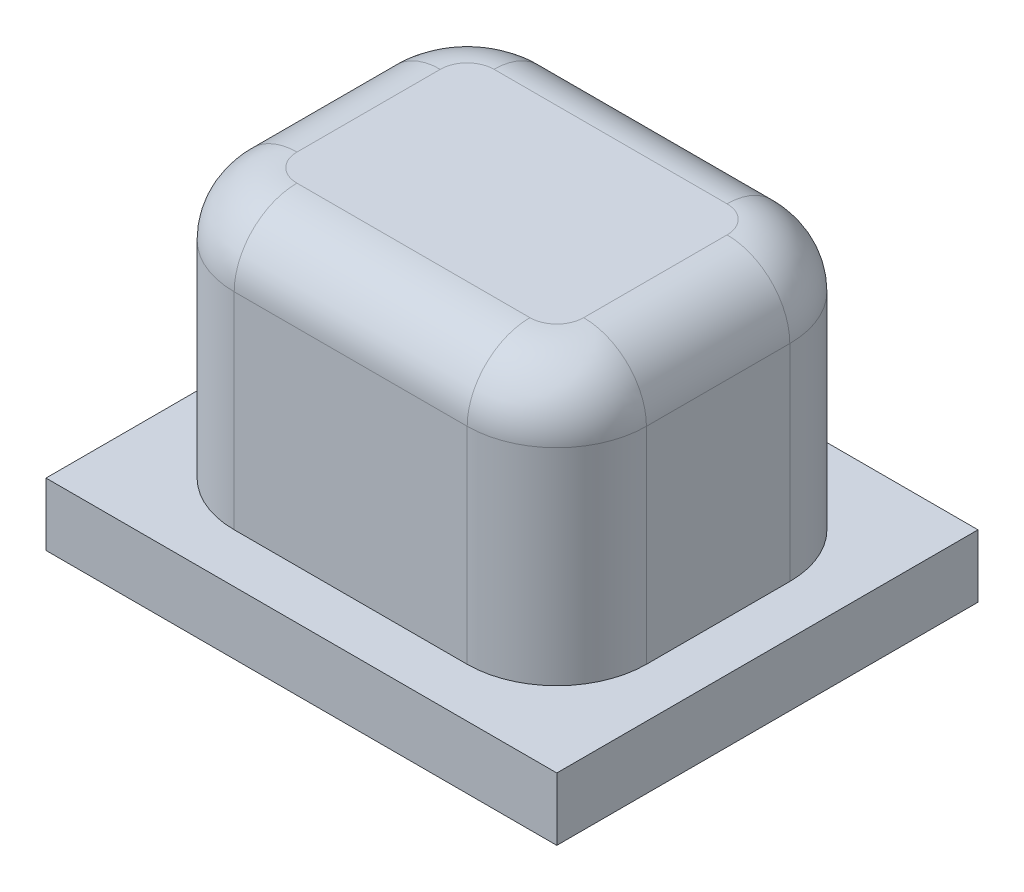
ISO-10303-21;
HEADER;
FILE_DESCRIPTION(('STEP AP214'),'2;1');
FILE_NAME('part.step','',(''),(''),'','','');
FILE_SCHEMA(('AUTOMOTIVE_DESIGN { 1 0 10303 214 1 1 1 1 }'));
ENDSEC;
DATA;
#1=APPLICATION_CONTEXT('core data for automotive mechanical design processes');
#2=APPLICATION_PROTOCOL_DEFINITION('international standard','automotive_design',2000,#1);
#3=PRODUCT_CONTEXT('',#1,'mechanical');
#4=PRODUCT('Part','Part','',(#3));
#5=PRODUCT_RELATED_PRODUCT_CATEGORY('part','',(#4));
#6=PRODUCT_DEFINITION_FORMATION('','',#4);
#7=PRODUCT_DEFINITION_CONTEXT('part definition',#1,'design');
#8=PRODUCT_DEFINITION('design','',#6,#7);
#9=PRODUCT_DEFINITION_SHAPE('','',#8);
#10=(LENGTH_UNIT() NAMED_UNIT(*) SI_UNIT(.MILLI.,.METRE.));
#11=(NAMED_UNIT(*) PLANE_ANGLE_UNIT() SI_UNIT($,.RADIAN.));
#12=(NAMED_UNIT(*) SI_UNIT($,.STERADIAN.) SOLID_ANGLE_UNIT());
#13=UNCERTAINTY_MEASURE_WITH_UNIT(LENGTH_MEASURE(1.E-05),#10,'distance_accuracy_value','');
#14=(GEOMETRIC_REPRESENTATION_CONTEXT(3) GLOBAL_UNCERTAINTY_ASSIGNED_CONTEXT((#13)) GLOBAL_UNIT_ASSIGNED_CONTEXT((#10,
#11,#12)) REPRESENTATION_CONTEXT('',''));
#15=CARTESIAN_POINT('',(0.,0.,0.));
#16=DIRECTION('',(0.,0.,1.));
#17=DIRECTION('',(1.,0.,0.));
#18=AXIS2_PLACEMENT_3D('',#15,#16,#17);
#19=CARTESIAN_POINT('',(1.3,3.,0.8));
#20=DIRECTION('',(0.,-1.,0.));
#21=DIRECTION('',(0.,0.,-1.));
#22=AXIS2_PLACEMENT_3D('',#19,#20,#21);
#23=CYLINDRICAL_SURFACE('',#22,1.);
#24=DIRECTION('',(0.,-1.,0.));
#25=VECTOR('',#24,1.);
#26=CARTESIAN_POINT('',(2.3,3.,0.8));
#27=LINE('',#26,#25);
#28=CARTESIAN_POINT('',(2.3,2.3,0.8));
#29=VERTEX_POINT('',#28);
#30=CARTESIAN_POINT('',(2.3,0.,0.8));
#31=VERTEX_POINT('',#30);
#32=EDGE_CURVE('E337',#29,#31,#27,.T.);
#33=ORIENTED_EDGE('',*,*,#32,.F.);
#34=CARTESIAN_POINT('',(1.3,2.3,0.8));
#35=DIRECTION('',(0.,1.,0.));
#36=DIRECTION('',(0.,0.,1.));
#37=AXIS2_PLACEMENT_3D('',#34,#35,#36);
#38=CIRCLE('',#37,1.);
#39=CARTESIAN_POINT('',(1.3,2.3,1.8));
#40=VERTEX_POINT('',#39);
#41=EDGE_CURVE('E361',#29,#40,#38,.F.);
#42=ORIENTED_EDGE('',*,*,#41,.T.);
#43=DIRECTION('',(0.,-1.,0.));
#44=VECTOR('',#43,1.);
#45=CARTESIAN_POINT('',(1.3,3.,1.8));
#46=LINE('',#45,#44);
#47=CARTESIAN_POINT('',(1.3,0.,1.8));
#48=VERTEX_POINT('',#47);
#49=EDGE_CURVE('E323',#40,#48,#46,.T.);
#50=ORIENTED_EDGE('',*,*,#49,.T.);
#51=CARTESIAN_POINT('',(1.3,0.,0.8));
#52=DIRECTION('',(0.,1.,0.));
#53=DIRECTION('',(0.,0.,1.));
#54=AXIS2_PLACEMENT_3D('',#51,#52,#53);
#55=CIRCLE('',#54,1.);
#56=EDGE_CURVE('E299',#48,#31,#55,.T.);
#57=ORIENTED_EDGE('',*,*,#56,.T.);
#58=EDGE_LOOP('',(#33,#42,#50,#57));
#59=FACE_BOUND('',#58,.T.);
#60=ADVANCED_FACE('F33',(#59),#23,.T.);
#61=CARTESIAN_POINT('',(2.3,3.,0.8));
#62=DIRECTION('',(-1.,0.,0.));
#63=DIRECTION('',(0.,0.,1.));
#64=AXIS2_PLACEMENT_3D('',#61,#62,#63);
#65=PLANE('',#64);
#66=DIRECTION('',(0.,-1.,0.));
#67=VECTOR('',#66,1.);
#68=CARTESIAN_POINT('',(2.3,3.,-0.8));
#69=LINE('',#68,#67);
#70=CARTESIAN_POINT('',(2.3,2.3,-0.8));
#71=VERTEX_POINT('',#70);
#72=CARTESIAN_POINT('',(2.3,0.,-0.8));
#73=VERTEX_POINT('',#72);
#74=EDGE_CURVE('E335',#71,#73,#69,.T.);
#75=ORIENTED_EDGE('',*,*,#74,.F.);
#76=DIRECTION('',(0.,0.,-1.));
#77=VECTOR('',#76,1.);
#78=CARTESIAN_POINT('',(2.3,2.3,0.8));
#79=LINE('',#78,#77);
#80=EDGE_CURVE('E359',#71,#29,#79,.F.);
#81=ORIENTED_EDGE('',*,*,#80,.T.);
#82=ORIENTED_EDGE('',*,*,#32,.T.);
#83=DIRECTION('',(0.,0.,-1.));
#84=VECTOR('',#83,1.);
#85=CARTESIAN_POINT('',(2.3,0.,0.8));
#86=LINE('',#85,#84);
#87=EDGE_CURVE('E302',#31,#73,#86,.T.);
#88=ORIENTED_EDGE('',*,*,#87,.T.);
#89=EDGE_LOOP('',(#75,#81,#82,#88));
#90=FACE_BOUND('',#89,.T.);
#91=ADVANCED_FACE('F436',(#90),#65,.F.);
#92=CARTESIAN_POINT('',(1.3,3.,-0.8));
#93=DIRECTION('',(0.,-1.,0.));
#94=DIRECTION('',(0.,0.,-1.));
#95=AXIS2_PLACEMENT_3D('',#92,#93,#94);
#96=CYLINDRICAL_SURFACE('',#95,1.);
#97=DIRECTION('',(0.,-1.,0.));
#98=VECTOR('',#97,1.);
#99=CARTESIAN_POINT('',(1.3,3.,-1.8));
#100=LINE('',#99,#98);
#101=CARTESIAN_POINT('',(1.3,2.3,-1.8));
#102=VERTEX_POINT('',#101);
#103=CARTESIAN_POINT('',(1.3,0.,-1.8));
#104=VERTEX_POINT('',#103);
#105=EDGE_CURVE('E333',#102,#104,#100,.T.);
#106=ORIENTED_EDGE('',*,*,#105,.F.);
#107=CARTESIAN_POINT('',(1.3,2.3,-0.8));
#108=DIRECTION('',(0.,1.,0.));
#109=DIRECTION('',(0.,0.,1.));
#110=AXIS2_PLACEMENT_3D('',#107,#108,#109);
#111=CIRCLE('',#110,1.);
#112=EDGE_CURVE('E356',#102,#71,#111,.F.);
#113=ORIENTED_EDGE('',*,*,#112,.T.);
#114=ORIENTED_EDGE('',*,*,#74,.T.);
#115=CARTESIAN_POINT('',(1.3,0.,-0.8));
#116=DIRECTION('',(0.,1.,0.));
#117=DIRECTION('',(0.,0.,-1.));
#118=AXIS2_PLACEMENT_3D('',#115,#116,#117);
#119=CIRCLE('',#118,1.);
#120=EDGE_CURVE('E305',#73,#104,#119,.T.);
#121=ORIENTED_EDGE('',*,*,#120,.T.);
#122=EDGE_LOOP('',(#106,#113,#114,#121));
#123=FACE_BOUND('',#122,.T.);
#124=ADVANCED_FACE('F433',(#123),#96,.T.);
#125=CARTESIAN_POINT('',(-1.3,3.,-1.8));
#126=DIRECTION('',(0.,0.,1.));
#127=DIRECTION('',(1.,0.,0.));
#128=AXIS2_PLACEMENT_3D('',#125,#126,#127);
#129=PLANE('',#128);
#130=DIRECTION('',(0.,-1.,0.));
#131=VECTOR('',#130,1.);
#132=CARTESIAN_POINT('',(-1.3,3.,-1.8));
#133=LINE('',#132,#131);
#134=CARTESIAN_POINT('',(-1.3,2.3,-1.8));
#135=VERTEX_POINT('',#134);
#136=CARTESIAN_POINT('',(-1.3,0.,-1.8));
#137=VERTEX_POINT('',#136);
#138=EDGE_CURVE('E331',#135,#137,#133,.T.);
#139=ORIENTED_EDGE('',*,*,#138,.F.);
#140=DIRECTION('',(-1.,0.,0.));
#141=VECTOR('',#140,1.);
#142=CARTESIAN_POINT('',(1.3,2.3,-1.8));
#143=LINE('',#142,#141);
#144=EDGE_CURVE('E11',#135,#102,#143,.F.);
#145=ORIENTED_EDGE('',*,*,#144,.T.);
#146=ORIENTED_EDGE('',*,*,#105,.T.);
#147=DIRECTION('',(-1.,0.,0.));
#148=VECTOR('',#147,1.);
#149=CARTESIAN_POINT('',(-1.3,0.,-1.8));
#150=LINE('',#149,#148);
#151=EDGE_CURVE('E308',#104,#137,#150,.T.);
#152=ORIENTED_EDGE('',*,*,#151,.T.);
#153=EDGE_LOOP('',(#139,#145,#146,#152));
#154=FACE_BOUND('',#153,.T.);
#155=ADVANCED_FACE('F415',(#154),#129,.F.);
#156=CARTESIAN_POINT('',(-1.3,3.,-0.8));
#157=DIRECTION('',(0.,-1.,0.));
#158=DIRECTION('',(0.,0.,-1.));
#159=AXIS2_PLACEMENT_3D('',#156,#157,#158);
#160=CYLINDRICAL_SURFACE('',#159,1.);
#161=DIRECTION('',(0.,-1.,0.));
#162=VECTOR('',#161,1.);
#163=CARTESIAN_POINT('',(-2.3,3.,-0.8));
#164=LINE('',#163,#162);
#165=CARTESIAN_POINT('',(-2.3,2.3,-0.8));
#166=VERTEX_POINT('',#165);
#167=CARTESIAN_POINT('',(-2.3,0.,-0.8));
#168=VERTEX_POINT('',#167);
#169=EDGE_CURVE('E329',#166,#168,#164,.T.);
#170=ORIENTED_EDGE('',*,*,#169,.F.);
#171=CARTESIAN_POINT('',(-1.3,2.3,-0.8));
#172=DIRECTION('',(0.,1.,0.));
#173=DIRECTION('',(0.,0.,1.));
#174=AXIS2_PLACEMENT_3D('',#171,#172,#173);
#175=CIRCLE('',#174,1.);
#176=EDGE_CURVE('E42',#166,#135,#175,.F.);
#177=ORIENTED_EDGE('',*,*,#176,.T.);
#178=ORIENTED_EDGE('',*,*,#138,.T.);
#179=CARTESIAN_POINT('',(-1.3,0.,-0.8));
#180=DIRECTION('',(0.,1.,0.));
#181=DIRECTION('',(0.,0.,-1.));
#182=AXIS2_PLACEMENT_3D('',#179,#180,#181);
#183=CIRCLE('',#182,1.);
#184=EDGE_CURVE('E311',#137,#168,#183,.T.);
#185=ORIENTED_EDGE('',*,*,#184,.T.);
#186=EDGE_LOOP('',(#170,#177,#178,#185));
#187=FACE_BOUND('',#186,.T.);
#188=ADVANCED_FACE('F411',(#187),#160,.T.);
#189=CARTESIAN_POINT('',(-2.3,3.,0.8));
#190=DIRECTION('',(1.,0.,0.));
#191=DIRECTION('',(0.,0.,-1.));
#192=AXIS2_PLACEMENT_3D('',#189,#190,#191);
#193=PLANE('',#192);
#194=DIRECTION('',(0.,-1.,0.));
#195=VECTOR('',#194,1.);
#196=CARTESIAN_POINT('',(-2.3,3.,0.8));
#197=LINE('',#196,#195);
#198=CARTESIAN_POINT('',(-2.3,2.3,0.8));
#199=VERTEX_POINT('',#198);
#200=CARTESIAN_POINT('',(-2.3,0.,0.8));
#201=VERTEX_POINT('',#200);
#202=EDGE_CURVE('E327',#199,#201,#197,.T.);
#203=ORIENTED_EDGE('',*,*,#202,.F.);
#204=DIRECTION('',(0.,0.,1.));
#205=VECTOR('',#204,1.);
#206=CARTESIAN_POINT('',(-2.3,2.3,-0.8));
#207=LINE('',#206,#205);
#208=EDGE_CURVE('E57',#199,#166,#207,.F.);
#209=ORIENTED_EDGE('',*,*,#208,.T.);
#210=ORIENTED_EDGE('',*,*,#169,.T.);
#211=DIRECTION('',(0.,0.,1.));
#212=VECTOR('',#211,1.);
#213=CARTESIAN_POINT('',(-2.3,0.,0.8));
#214=LINE('',#213,#212);
#215=EDGE_CURVE('E314',#168,#201,#214,.T.);
#216=ORIENTED_EDGE('',*,*,#215,.T.);
#217=EDGE_LOOP('',(#203,#209,#210,#216));
#218=FACE_BOUND('',#217,.T.);
#219=ADVANCED_FACE('F403',(#218),#193,.F.);
#220=CARTESIAN_POINT('',(-1.3,3.,0.8));
#221=DIRECTION('',(0.,-1.,0.));
#222=DIRECTION('',(0.,0.,-1.));
#223=AXIS2_PLACEMENT_3D('',#220,#221,#222);
#224=CYLINDRICAL_SURFACE('',#223,1.);
#225=DIRECTION('',(0.,-1.,0.));
#226=VECTOR('',#225,1.);
#227=CARTESIAN_POINT('',(-1.3,3.,1.8));
#228=LINE('',#227,#226);
#229=CARTESIAN_POINT('',(-1.3,2.3,1.8));
#230=VERTEX_POINT('',#229);
#231=CARTESIAN_POINT('',(-1.3,0.,1.8));
#232=VERTEX_POINT('',#231);
#233=EDGE_CURVE('E325',#230,#232,#228,.T.);
#234=ORIENTED_EDGE('',*,*,#233,.F.);
#235=CARTESIAN_POINT('',(-1.3,2.3,0.8));
#236=DIRECTION('',(0.,1.,0.));
#237=DIRECTION('',(0.,0.,1.));
#238=AXIS2_PLACEMENT_3D('',#235,#236,#237);
#239=CIRCLE('',#238,1.);
#240=EDGE_CURVE('E365',#230,#199,#239,.F.);
#241=ORIENTED_EDGE('',*,*,#240,.T.);
#242=ORIENTED_EDGE('',*,*,#202,.T.);
#243=CARTESIAN_POINT('',(-1.3,0.,0.8));
#244=DIRECTION('',(0.,1.,0.));
#245=DIRECTION('',(0.,0.,-1.));
#246=AXIS2_PLACEMENT_3D('',#243,#244,#245);
#247=CIRCLE('',#246,1.);
#248=EDGE_CURVE('E317',#201,#232,#247,.T.);
#249=ORIENTED_EDGE('',*,*,#248,.T.);
#250=EDGE_LOOP('',(#234,#241,#242,#249));
#251=FACE_BOUND('',#250,.T.);
#252=ADVANCED_FACE('F401',(#251),#224,.T.);
#253=CARTESIAN_POINT('',(-1.3,3.,1.8));
#254=DIRECTION('',(0.,0.,-1.));
#255=DIRECTION('',(-1.,0.,0.));
#256=AXIS2_PLACEMENT_3D('',#253,#254,#255);
#257=PLANE('',#256);
#258=ORIENTED_EDGE('',*,*,#49,.F.);
#259=DIRECTION('',(1.,0.,0.));
#260=VECTOR('',#259,1.);
#261=CARTESIAN_POINT('',(-1.3,2.3,1.8));
#262=LINE('',#261,#260);
#263=EDGE_CURVE('E363',#40,#230,#262,.F.);
#264=ORIENTED_EDGE('',*,*,#263,.T.);
#265=ORIENTED_EDGE('',*,*,#233,.T.);
#266=DIRECTION('',(1.,0.,0.));
#267=VECTOR('',#266,1.);
#268=CARTESIAN_POINT('',(-1.3,0.,1.8));
#269=LINE('',#268,#267);
#270=EDGE_CURVE('E320',#232,#48,#269,.T.);
#271=ORIENTED_EDGE('',*,*,#270,.T.);
#272=EDGE_LOOP('',(#258,#264,#265,#271));
#273=FACE_BOUND('',#272,.T.);
#274=ADVANCED_FACE('F443',(#273),#257,.F.);
#275=CARTESIAN_POINT('',(1.3,3.,0.8));
#276=DIRECTION('',(0.,1.,0.));
#277=DIRECTION('',(0.,0.,1.));
#278=AXIS2_PLACEMENT_3D('',#275,#276,#277);
#279=PLANE('',#278);
#280=DIRECTION('',(0.,0.,-1.));
#281=VECTOR('',#280,1.);
#282=CARTESIAN_POINT('',(1.6,3.,-0.8));
#283=LINE('',#282,#281);
#284=CARTESIAN_POINT('',(1.6,3.,0.8));
#285=VERTEX_POINT('',#284);
#286=CARTESIAN_POINT('',(1.6,3.,-0.8));
#287=VERTEX_POINT('',#286);
#288=EDGE_CURVE('E351',#285,#287,#283,.T.);
#289=ORIENTED_EDGE('',*,*,#288,.T.);
#290=CARTESIAN_POINT('',(1.3,3.,-0.8));
#291=DIRECTION('',(0.,1.,0.));
#292=DIRECTION('',(0.,0.,1.));
#293=AXIS2_PLACEMENT_3D('',#290,#291,#292);
#294=CIRCLE('',#293,0.3);
#295=CARTESIAN_POINT('',(1.3,3.,-1.1));
#296=VERTEX_POINT('',#295);
#297=EDGE_CURVE('E353',#287,#296,#294,.T.);
#298=ORIENTED_EDGE('',*,*,#297,.T.);
#299=DIRECTION('',(-1.,0.,0.));
#300=VECTOR('',#299,1.);
#301=CARTESIAN_POINT('',(-1.3,3.,-1.1));
#302=LINE('',#301,#300);
#303=CARTESIAN_POINT('',(-1.3,3.,-1.1));
#304=VERTEX_POINT('',#303);
#305=EDGE_CURVE('E339',#296,#304,#302,.T.);
#306=ORIENTED_EDGE('',*,*,#305,.T.);
#307=CARTESIAN_POINT('',(-1.3,3.,-0.8));
#308=DIRECTION('',(0.,1.,0.));
#309=DIRECTION('',(0.,0.,1.));
#310=AXIS2_PLACEMENT_3D('',#307,#308,#309);
#311=CIRCLE('',#310,0.3);
#312=CARTESIAN_POINT('',(-1.6,3.,-0.8));
#313=VERTEX_POINT('',#312);
#314=EDGE_CURVE('E341',#304,#313,#311,.T.);
#315=ORIENTED_EDGE('',*,*,#314,.T.);
#316=DIRECTION('',(0.,0.,1.));
#317=VECTOR('',#316,1.);
#318=CARTESIAN_POINT('',(-1.6,3.,0.8));
#319=LINE('',#318,#317);
#320=CARTESIAN_POINT('',(-1.6,3.,0.8));
#321=VERTEX_POINT('',#320);
#322=EDGE_CURVE('E343',#313,#321,#319,.T.);
#323=ORIENTED_EDGE('',*,*,#322,.T.);
#324=CARTESIAN_POINT('',(-1.3,3.,0.8));
#325=DIRECTION('',(0.,1.,0.));
#326=DIRECTION('',(0.,0.,1.));
#327=AXIS2_PLACEMENT_3D('',#324,#325,#326);
#328=CIRCLE('',#327,0.3);
#329=CARTESIAN_POINT('',(-1.3,3.,1.1));
#330=VERTEX_POINT('',#329);
#331=EDGE_CURVE('E345',#321,#330,#328,.T.);
#332=ORIENTED_EDGE('',*,*,#331,.T.);
#333=DIRECTION('',(1.,0.,0.));
#334=VECTOR('',#333,1.);
#335=CARTESIAN_POINT('',(1.3,3.,1.1));
#336=LINE('',#335,#334);
#337=CARTESIAN_POINT('',(1.3,3.,1.1));
#338=VERTEX_POINT('',#337);
#339=EDGE_CURVE('E347',#330,#338,#336,.T.);
#340=ORIENTED_EDGE('',*,*,#339,.T.);
#341=CARTESIAN_POINT('',(1.3,3.,0.8));
#342=DIRECTION('',(0.,1.,0.));
#343=DIRECTION('',(0.,0.,1.));
#344=AXIS2_PLACEMENT_3D('',#341,#342,#343);
#345=CIRCLE('',#344,0.3);
#346=EDGE_CURVE('E349',#338,#285,#345,.T.);
#347=ORIENTED_EDGE('',*,*,#346,.T.);
#348=EDGE_LOOP('',(#289,#298,#306,#315,#323,#332,#340,#347));
#349=FACE_BOUND('',#348,.T.);
#350=ADVANCED_FACE('F445',(#349),#279,.T.);
#351=CARTESIAN_POINT('',(0.,0.,0.));
#352=DIRECTION('',(0.,1.,0.));
#353=DIRECTION('',(0.,0.,1.));
#354=AXIS2_PLACEMENT_3D('',#351,#352,#353);
#355=PLANE('',#354);
#356=DIRECTION('',(0.,0.,1.));
#357=VECTOR('',#356,1.);
#358=CARTESIAN_POINT('',(2.85,0.,-2.35));
#359=LINE('',#358,#357);
#360=CARTESIAN_POINT('',(2.85,0.,-2.35));
#361=VERTEX_POINT('',#360);
#362=CARTESIAN_POINT('',(2.85,0.,2.35));
#363=VERTEX_POINT('',#362);
#364=EDGE_CURVE('E258',#361,#363,#359,.T.);
#365=ORIENTED_EDGE('',*,*,#364,.F.);
#366=DIRECTION('',(1.,0.,0.));
#367=VECTOR('',#366,1.);
#368=CARTESIAN_POINT('',(-2.85,0.,-2.35));
#369=LINE('',#368,#367);
#370=CARTESIAN_POINT('',(-2.85,0.,-2.35));
#371=VERTEX_POINT('',#370);
#372=EDGE_CURVE('E274',#371,#361,#369,.T.);
#373=ORIENTED_EDGE('',*,*,#372,.F.);
#374=DIRECTION('',(0.,0.,-1.));
#375=VECTOR('',#374,1.);
#376=CARTESIAN_POINT('',(-2.85,0.,-2.35));
#377=LINE('',#376,#375);
#378=CARTESIAN_POINT('',(-2.85,0.,2.35));
#379=VERTEX_POINT('',#378);
#380=EDGE_CURVE('E285',#379,#371,#377,.T.);
#381=ORIENTED_EDGE('',*,*,#380,.F.);
#382=DIRECTION('',(-1.,0.,0.));
#383=VECTOR('',#382,1.);
#384=CARTESIAN_POINT('',(-2.85,0.,2.35));
#385=LINE('',#384,#383);
#386=EDGE_CURVE('E283',#363,#379,#385,.T.);
#387=ORIENTED_EDGE('',*,*,#386,.F.);
#388=EDGE_LOOP('',(#365,#373,#381,#387));
#389=FACE_BOUND('',#388,.T.);
#390=ORIENTED_EDGE('',*,*,#56,.F.);
#391=ORIENTED_EDGE('',*,*,#270,.F.);
#392=ORIENTED_EDGE('',*,*,#248,.F.);
#393=ORIENTED_EDGE('',*,*,#215,.F.);
#394=ORIENTED_EDGE('',*,*,#184,.F.);
#395=ORIENTED_EDGE('',*,*,#151,.F.);
#396=ORIENTED_EDGE('',*,*,#120,.F.);
#397=ORIENTED_EDGE('',*,*,#87,.F.);
#398=EDGE_LOOP('',(#390,#391,#392,#393,#394,#395,#396,#397));
#399=FACE_BOUND('',#398,.T.);
#400=ADVANCED_FACE('F408',(#389,#399),#355,.T.);
#401=CARTESIAN_POINT('',(2.85,-0.7,-2.35));
#402=DIRECTION('',(-1.,0.,0.));
#403=DIRECTION('',(0.,0.,1.));
#404=AXIS2_PLACEMENT_3D('',#401,#402,#403);
#405=PLANE('',#404);
#406=ORIENTED_EDGE('',*,*,#364,.T.);
#407=DIRECTION('',(0.,1.,0.));
#408=VECTOR('',#407,1.);
#409=CARTESIAN_POINT('',(2.85,-0.7,2.35));
#410=LINE('',#409,#408);
#411=CARTESIAN_POINT('',(2.85,-0.7,2.35));
#412=VERTEX_POINT('',#411);
#413=EDGE_CURVE('E296',#412,#363,#410,.T.);
#414=ORIENTED_EDGE('',*,*,#413,.F.);
#415=DIRECTION('',(0.,0.,1.));
#416=VECTOR('',#415,1.);
#417=CARTESIAN_POINT('',(2.85,-0.7,-2.35));
#418=LINE('',#417,#416);
#419=CARTESIAN_POINT('',(2.85,-0.7,-2.35));
#420=VERTEX_POINT('',#419);
#421=EDGE_CURVE('E270',#420,#412,#418,.T.);
#422=ORIENTED_EDGE('',*,*,#421,.F.);
#423=DIRECTION('',(0.,1.,0.));
#424=VECTOR('',#423,1.);
#425=CARTESIAN_POINT('',(2.85,-0.7,-2.35));
#426=LINE('',#425,#424);
#427=EDGE_CURVE('E280',#420,#361,#426,.T.);
#428=ORIENTED_EDGE('',*,*,#427,.T.);
#429=EDGE_LOOP('',(#406,#414,#422,#428));
#430=FACE_BOUND('',#429,.T.);
#431=ADVANCED_FACE('F524',(#430),#405,.F.);
#432=CARTESIAN_POINT('',(-2.85,-0.7,2.35));
#433=DIRECTION('',(0.,0.,-1.));
#434=DIRECTION('',(-1.,0.,0.));
#435=AXIS2_PLACEMENT_3D('',#432,#433,#434);
#436=PLANE('',#435);
#437=ORIENTED_EDGE('',*,*,#386,.T.);
#438=DIRECTION('',(0.,1.,0.));
#439=VECTOR('',#438,1.);
#440=CARTESIAN_POINT('',(-2.85,-0.7,2.35));
#441=LINE('',#440,#439);
#442=CARTESIAN_POINT('',(-2.85,-0.7,2.35));
#443=VERTEX_POINT('',#442);
#444=EDGE_CURVE('E293',#443,#379,#441,.T.);
#445=ORIENTED_EDGE('',*,*,#444,.F.);
#446=DIRECTION('',(-1.,0.,0.));
#447=VECTOR('',#446,1.);
#448=CARTESIAN_POINT('',(-2.85,-0.7,2.35));
#449=LINE('',#448,#447);
#450=EDGE_CURVE('E273',#412,#443,#449,.T.);
#451=ORIENTED_EDGE('',*,*,#450,.F.);
#452=ORIENTED_EDGE('',*,*,#413,.T.);
#453=EDGE_LOOP('',(#437,#445,#451,#452));
#454=FACE_BOUND('',#453,.T.);
#455=ADVANCED_FACE('F532',(#454),#436,.F.);
#456=CARTESIAN_POINT('',(-2.85,-0.7,-2.35));
#457=DIRECTION('',(1.,0.,0.));
#458=DIRECTION('',(0.,0.,-1.));
#459=AXIS2_PLACEMENT_3D('',#456,#457,#458);
#460=PLANE('',#459);
#461=ORIENTED_EDGE('',*,*,#380,.T.);
#462=DIRECTION('',(0.,1.,0.));
#463=VECTOR('',#462,1.);
#464=CARTESIAN_POINT('',(-2.85,-0.7,-2.35));
#465=LINE('',#464,#463);
#466=CARTESIAN_POINT('',(-2.85,-0.7,-2.35));
#467=VERTEX_POINT('',#466);
#468=EDGE_CURVE('E290',#467,#371,#465,.T.);
#469=ORIENTED_EDGE('',*,*,#468,.F.);
#470=DIRECTION('',(0.,0.,-1.));
#471=VECTOR('',#470,1.);
#472=CARTESIAN_POINT('',(-2.85,-0.7,-2.35));
#473=LINE('',#472,#471);
#474=EDGE_CURVE('E276',#443,#467,#473,.T.);
#475=ORIENTED_EDGE('',*,*,#474,.F.);
#476=ORIENTED_EDGE('',*,*,#444,.T.);
#477=EDGE_LOOP('',(#461,#469,#475,#476));
#478=FACE_BOUND('',#477,.T.);
#479=ADVANCED_FACE('F528',(#478),#460,.F.);
#480=CARTESIAN_POINT('',(-2.85,-0.7,-2.35));
#481=DIRECTION('',(0.,0.,1.));
#482=DIRECTION('',(1.,0.,0.));
#483=AXIS2_PLACEMENT_3D('',#480,#481,#482);
#484=PLANE('',#483);
#485=ORIENTED_EDGE('',*,*,#372,.T.);
#486=ORIENTED_EDGE('',*,*,#427,.F.);
#487=DIRECTION('',(1.,0.,0.));
#488=VECTOR('',#487,1.);
#489=CARTESIAN_POINT('',(-2.85,-0.7,-2.35));
#490=LINE('',#489,#488);
#491=EDGE_CURVE('E278',#467,#420,#490,.T.);
#492=ORIENTED_EDGE('',*,*,#491,.F.);
#493=ORIENTED_EDGE('',*,*,#468,.T.);
#494=EDGE_LOOP('',(#485,#486,#492,#493));
#495=FACE_BOUND('',#494,.T.);
#496=ADVANCED_FACE('F520',(#495),#484,.F.);
#497=CARTESIAN_POINT('',(0.,-0.7,0.));
#498=DIRECTION('',(0.,1.,0.));
#499=DIRECTION('',(0.,0.,1.));
#500=AXIS2_PLACEMENT_3D('',#497,#498,#499);
#501=PLANE('',#500);
#502=DIRECTION('',(-1.,0.,0.));
#503=VECTOR('',#502,1.);
#504=CARTESIAN_POINT('',(-0.75,-0.7,1.25));
#505=LINE('',#504,#503);
#506=CARTESIAN_POINT('',(0.75,-0.7,1.25));
#507=VERTEX_POINT('',#506);
#508=CARTESIAN_POINT('',(-0.75,-0.7,1.25));
#509=VERTEX_POINT('',#508);
#510=EDGE_CURVE('E240',#507,#509,#505,.T.);
#511=ORIENTED_EDGE('',*,*,#510,.F.);
#512=CARTESIAN_POINT('',(0.75,-0.7,0.25));
#513=DIRECTION('',(0.,-1.,0.));
#514=DIRECTION('',(0.,0.,1.));
#515=AXIS2_PLACEMENT_3D('',#512,#513,#514);
#516=CIRCLE('',#515,1.);
#517=CARTESIAN_POINT('',(1.75,-0.7,0.25));
#518=VERTEX_POINT('',#517);
#519=EDGE_CURVE('E202',#518,#507,#516,.T.);
#520=ORIENTED_EDGE('',*,*,#519,.F.);
#521=DIRECTION('',(0.,0.,1.));
#522=VECTOR('',#521,1.);
#523=CARTESIAN_POINT('',(1.75,-0.7,-0.25));
#524=LINE('',#523,#522);
#525=CARTESIAN_POINT('',(1.75,-0.7,-0.25));
#526=VERTEX_POINT('',#525);
#527=EDGE_CURVE('E220',#526,#518,#524,.T.);
#528=ORIENTED_EDGE('',*,*,#527,.F.);
#529=CARTESIAN_POINT('',(0.75,-0.7,-0.25));
#530=DIRECTION('',(0.,-1.,0.));
#531=DIRECTION('',(0.,0.,-1.));
#532=AXIS2_PLACEMENT_3D('',#529,#530,#531);
#533=CIRCLE('',#532,1.);
#534=CARTESIAN_POINT('',(0.75,-0.7,-1.25));
#535=VERTEX_POINT('',#534);
#536=EDGE_CURVE('E223',#535,#526,#533,.T.);
#537=ORIENTED_EDGE('',*,*,#536,.F.);
#538=DIRECTION('',(1.,0.,0.));
#539=VECTOR('',#538,1.);
#540=CARTESIAN_POINT('',(-0.75,-0.7,-1.25));
#541=LINE('',#540,#539);
#542=CARTESIAN_POINT('',(-0.75,-0.7,-1.25));
#543=VERTEX_POINT('',#542);
#544=EDGE_CURVE('E251',#543,#535,#541,.T.);
#545=ORIENTED_EDGE('',*,*,#544,.F.);
#546=CARTESIAN_POINT('',(-0.75,-0.7,-0.25));
#547=DIRECTION('',(0.,-1.,0.));
#548=DIRECTION('',(0.,0.,1.));
#549=AXIS2_PLACEMENT_3D('',#546,#547,#548);
#550=CIRCLE('',#549,1.);
#551=CARTESIAN_POINT('',(-1.75,-0.7,-0.25));
#552=VERTEX_POINT('',#551);
#553=EDGE_CURVE('E248',#552,#543,#550,.T.);
#554=ORIENTED_EDGE('',*,*,#553,.F.);
#555=DIRECTION('',(0.,0.,-1.));
#556=VECTOR('',#555,1.);
#557=CARTESIAN_POINT('',(-1.75,-0.7,-0.25));
#558=LINE('',#557,#556);
#559=CARTESIAN_POINT('',(-1.75,-0.7,0.25));
#560=VERTEX_POINT('',#559);
#561=EDGE_CURVE('E245',#560,#552,#558,.T.);
#562=ORIENTED_EDGE('',*,*,#561,.F.);
#563=CARTESIAN_POINT('',(-0.75,-0.7,0.25));
#564=DIRECTION('',(0.,-1.,0.));
#565=DIRECTION('',(0.,0.,1.));
#566=AXIS2_PLACEMENT_3D('',#563,#564,#565);
#567=CIRCLE('',#566,1.);
#568=EDGE_CURVE('E242',#509,#560,#567,.T.);
#569=ORIENTED_EDGE('',*,*,#568,.F.);
#570=EDGE_LOOP('',(#511,#520,#528,#537,#545,#554,#562,#569));
#571=FACE_BOUND('',#570,.T.);
#572=ORIENTED_EDGE('',*,*,#421,.T.);
#573=ORIENTED_EDGE('',*,*,#450,.T.);
#574=ORIENTED_EDGE('',*,*,#474,.T.);
#575=ORIENTED_EDGE('',*,*,#491,.T.);
#576=EDGE_LOOP('',(#572,#573,#574,#575));
#577=FACE_BOUND('',#576,.T.);
#578=ADVANCED_FACE('F517',(#571,#577),#501,.F.);
#579=CARTESIAN_POINT('',(0.75,2.1,0.25));
#580=DIRECTION('',(0.,-1.,0.));
#581=DIRECTION('',(0.,0.,-1.));
#582=AXIS2_PLACEMENT_3D('',#579,#580,#581);
#583=CYLINDRICAL_SURFACE('',#582,1.);
#584=ORIENTED_EDGE('',*,*,#519,.T.);
#585=DIRECTION('',(0.,-1.,0.));
#586=VECTOR('',#585,1.);
#587=CARTESIAN_POINT('',(0.75,2.1,1.25));
#588=LINE('',#587,#586);
#589=CARTESIAN_POINT('',(0.75,2.1,1.25));
#590=VERTEX_POINT('',#589);
#591=EDGE_CURVE('E195',#590,#507,#588,.T.);
#592=ORIENTED_EDGE('',*,*,#591,.F.);
#593=CARTESIAN_POINT('',(0.75,2.1,0.25));
#594=DIRECTION('',(0.,-1.,0.));
#595=DIRECTION('',(0.,0.,1.));
#596=AXIS2_PLACEMENT_3D('',#593,#594,#595);
#597=CIRCLE('',#596,1.);
#598=CARTESIAN_POINT('',(1.75,2.1,0.25));
#599=VERTEX_POINT('',#598);
#600=EDGE_CURVE('E199',#599,#590,#597,.T.);
#601=ORIENTED_EDGE('',*,*,#600,.F.);
#602=DIRECTION('',(0.,-1.,0.));
#603=VECTOR('',#602,1.);
#604=CARTESIAN_POINT('',(1.75,2.1,0.25));
#605=LINE('',#604,#603);
#606=EDGE_CURVE('E256',#599,#518,#605,.T.);
#607=ORIENTED_EDGE('',*,*,#606,.T.);
#608=EDGE_LOOP('',(#584,#592,#601,#607));
#609=FACE_BOUND('',#608,.T.);
#610=ADVANCED_FACE('F197',(#609),#583,.F.);
#611=CARTESIAN_POINT('',(1.75,2.1,-0.25));
#612=DIRECTION('',(1.,0.,0.));
#613=DIRECTION('',(0.,0.,-1.));
#614=AXIS2_PLACEMENT_3D('',#611,#612,#613);
#615=PLANE('',#614);
#616=ORIENTED_EDGE('',*,*,#527,.T.);
#617=ORIENTED_EDGE('',*,*,#606,.F.);
#618=DIRECTION('',(0.,0.,1.));
#619=VECTOR('',#618,1.);
#620=CARTESIAN_POINT('',(1.75,2.1,-0.25));
#621=LINE('',#620,#619);
#622=CARTESIAN_POINT('',(1.75,2.1,-0.25));
#623=VERTEX_POINT('',#622);
#624=EDGE_CURVE('E207',#623,#599,#621,.T.);
#625=ORIENTED_EDGE('',*,*,#624,.F.);
#626=DIRECTION('',(0.,-1.,0.));
#627=VECTOR('',#626,1.);
#628=CARTESIAN_POINT('',(1.75,2.1,-0.25));
#629=LINE('',#628,#627);
#630=EDGE_CURVE('E259',#623,#526,#629,.T.);
#631=ORIENTED_EDGE('',*,*,#630,.T.);
#632=EDGE_LOOP('',(#616,#617,#625,#631));
#633=FACE_BOUND('',#632,.T.);
#634=ADVANCED_FACE('F492',(#633),#615,.F.);
#635=CARTESIAN_POINT('',(0.75,2.1,-0.25));
#636=DIRECTION('',(0.,-1.,0.));
#637=DIRECTION('',(0.,0.,-1.));
#638=AXIS2_PLACEMENT_3D('',#635,#636,#637);
#639=CYLINDRICAL_SURFACE('',#638,1.);
#640=ORIENTED_EDGE('',*,*,#536,.T.);
#641=ORIENTED_EDGE('',*,*,#630,.F.);
#642=CARTESIAN_POINT('',(0.75,2.1,-0.25));
#643=DIRECTION('',(0.,-1.,0.));
#644=DIRECTION('',(0.,0.,-1.));
#645=AXIS2_PLACEMENT_3D('',#642,#643,#644);
#646=CIRCLE('',#645,1.);
#647=CARTESIAN_POINT('',(0.75,2.1,-1.25));
#648=VERTEX_POINT('',#647);
#649=EDGE_CURVE('E236',#648,#623,#646,.T.);
#650=ORIENTED_EDGE('',*,*,#649,.F.);
#651=DIRECTION('',(0.,-1.,0.));
#652=VECTOR('',#651,1.);
#653=CARTESIAN_POINT('',(0.75,2.1,-1.25));
#654=LINE('',#653,#652);
#655=EDGE_CURVE('E261',#648,#535,#654,.T.);
#656=ORIENTED_EDGE('',*,*,#655,.T.);
#657=EDGE_LOOP('',(#640,#641,#650,#656));
#658=FACE_BOUND('',#657,.T.);
#659=ADVANCED_FACE('F495',(#658),#639,.F.);
#660=CARTESIAN_POINT('',(-0.75,2.1,-1.25));
#661=DIRECTION('',(0.,0.,-1.));
#662=DIRECTION('',(-1.,0.,0.));
#663=AXIS2_PLACEMENT_3D('',#660,#661,#662);
#664=PLANE('',#663);
#665=ORIENTED_EDGE('',*,*,#544,.T.);
#666=ORIENTED_EDGE('',*,*,#655,.F.);
#667=DIRECTION('',(1.,0.,0.));
#668=VECTOR('',#667,1.);
#669=CARTESIAN_POINT('',(-0.75,2.1,-1.25));
#670=LINE('',#669,#668);
#671=CARTESIAN_POINT('',(-0.75,2.1,-1.25));
#672=VERTEX_POINT('',#671);
#673=EDGE_CURVE('E233',#672,#648,#670,.T.);
#674=ORIENTED_EDGE('',*,*,#673,.F.);
#675=DIRECTION('',(0.,-1.,0.));
#676=VECTOR('',#675,1.);
#677=CARTESIAN_POINT('',(-0.75,2.1,-1.25));
#678=LINE('',#677,#676);
#679=EDGE_CURVE('E263',#672,#543,#678,.T.);
#680=ORIENTED_EDGE('',*,*,#679,.T.);
#681=EDGE_LOOP('',(#665,#666,#674,#680));
#682=FACE_BOUND('',#681,.T.);
#683=ADVANCED_FACE('F499',(#682),#664,.F.);
#684=CARTESIAN_POINT('',(-0.75,2.1,-0.25));
#685=DIRECTION('',(0.,-1.,0.));
#686=DIRECTION('',(0.,0.,-1.));
#687=AXIS2_PLACEMENT_3D('',#684,#685,#686);
#688=CYLINDRICAL_SURFACE('',#687,1.);
#689=ORIENTED_EDGE('',*,*,#553,.T.);
#690=ORIENTED_EDGE('',*,*,#679,.F.);
#691=CARTESIAN_POINT('',(-0.75,2.1,-0.25));
#692=DIRECTION('',(0.,-1.,0.));
#693=DIRECTION('',(0.,0.,1.));
#694=AXIS2_PLACEMENT_3D('',#691,#692,#693);
#695=CIRCLE('',#694,1.);
#696=CARTESIAN_POINT('',(-1.75,2.1,-0.25));
#697=VERTEX_POINT('',#696);
#698=EDGE_CURVE('E230',#697,#672,#695,.T.);
#699=ORIENTED_EDGE('',*,*,#698,.F.);
#700=DIRECTION('',(0.,-1.,0.));
#701=VECTOR('',#700,1.);
#702=CARTESIAN_POINT('',(-1.75,2.1,-0.25));
#703=LINE('',#702,#701);
#704=EDGE_CURVE('E265',#697,#552,#703,.T.);
#705=ORIENTED_EDGE('',*,*,#704,.T.);
#706=EDGE_LOOP('',(#689,#690,#699,#705));
#707=FACE_BOUND('',#706,.T.);
#708=ADVANCED_FACE('F503',(#707),#688,.F.);
#709=CARTESIAN_POINT('',(-1.75,2.1,-0.25));
#710=DIRECTION('',(-1.,0.,0.));
#711=DIRECTION('',(0.,0.,1.));
#712=AXIS2_PLACEMENT_3D('',#709,#710,#711);
#713=PLANE('',#712);
#714=ORIENTED_EDGE('',*,*,#561,.T.);
#715=ORIENTED_EDGE('',*,*,#704,.F.);
#716=DIRECTION('',(0.,0.,-1.));
#717=VECTOR('',#716,1.);
#718=CARTESIAN_POINT('',(-1.75,2.1,-0.25));
#719=LINE('',#718,#717);
#720=CARTESIAN_POINT('',(-1.75,2.1,0.25));
#721=VERTEX_POINT('',#720);
#722=EDGE_CURVE('E227',#721,#697,#719,.T.);
#723=ORIENTED_EDGE('',*,*,#722,.F.);
#724=DIRECTION('',(0.,-1.,0.));
#725=VECTOR('',#724,1.);
#726=CARTESIAN_POINT('',(-1.75,2.1,0.25));
#727=LINE('',#726,#725);
#728=EDGE_CURVE('E267',#721,#560,#727,.T.);
#729=ORIENTED_EDGE('',*,*,#728,.T.);
#730=EDGE_LOOP('',(#714,#715,#723,#729));
#731=FACE_BOUND('',#730,.T.);
#732=ADVANCED_FACE('F507',(#731),#713,.F.);
#733=CARTESIAN_POINT('',(-0.75,2.1,0.25));
#734=DIRECTION('',(0.,-1.,0.));
#735=DIRECTION('',(0.,0.,-1.));
#736=AXIS2_PLACEMENT_3D('',#733,#734,#735);
#737=CYLINDRICAL_SURFACE('',#736,1.);
#738=ORIENTED_EDGE('',*,*,#568,.T.);
#739=ORIENTED_EDGE('',*,*,#728,.F.);
#740=CARTESIAN_POINT('',(-0.75,2.1,0.25));
#741=DIRECTION('',(0.,-1.,0.));
#742=DIRECTION('',(0.,0.,1.));
#743=AXIS2_PLACEMENT_3D('',#740,#741,#742);
#744=CIRCLE('',#743,1.);
#745=CARTESIAN_POINT('',(-0.75,2.1,1.25));
#746=VERTEX_POINT('',#745);
#747=EDGE_CURVE('E215',#746,#721,#744,.T.);
#748=ORIENTED_EDGE('',*,*,#747,.F.);
#749=DIRECTION('',(0.,-1.,0.));
#750=VECTOR('',#749,1.);
#751=CARTESIAN_POINT('',(-0.75,2.1,1.25));
#752=LINE('',#751,#750);
#753=EDGE_CURVE('E206',#746,#509,#752,.T.);
#754=ORIENTED_EDGE('',*,*,#753,.T.);
#755=EDGE_LOOP('',(#738,#739,#748,#754));
#756=FACE_BOUND('',#755,.T.);
#757=ADVANCED_FACE('F489',(#756),#737,.F.);
#758=CARTESIAN_POINT('',(-0.75,2.1,1.25));
#759=DIRECTION('',(0.,0.,1.));
#760=DIRECTION('',(1.,0.,0.));
#761=AXIS2_PLACEMENT_3D('',#758,#759,#760);
#762=PLANE('',#761);
#763=ORIENTED_EDGE('',*,*,#510,.T.);
#764=ORIENTED_EDGE('',*,*,#753,.F.);
#765=DIRECTION('',(-1.,0.,0.));
#766=VECTOR('',#765,1.);
#767=CARTESIAN_POINT('',(-0.75,2.1,1.25));
#768=LINE('',#767,#766);
#769=EDGE_CURVE('E210',#590,#746,#768,.T.);
#770=ORIENTED_EDGE('',*,*,#769,.F.);
#771=ORIENTED_EDGE('',*,*,#591,.T.);
#772=EDGE_LOOP('',(#763,#764,#770,#771));
#773=FACE_BOUND('',#772,.T.);
#774=ADVANCED_FACE('F211',(#773),#762,.F.);
#775=CARTESIAN_POINT('',(0.75,2.1,0.25));
#776=DIRECTION('',(0.,1.,0.));
#777=DIRECTION('',(0.,0.,1.));
#778=AXIS2_PLACEMENT_3D('',#775,#776,#777);
#779=PLANE('',#778);
#780=ORIENTED_EDGE('',*,*,#600,.T.);
#781=ORIENTED_EDGE('',*,*,#769,.T.);
#782=ORIENTED_EDGE('',*,*,#747,.T.);
#783=ORIENTED_EDGE('',*,*,#722,.T.);
#784=ORIENTED_EDGE('',*,*,#698,.T.);
#785=ORIENTED_EDGE('',*,*,#673,.T.);
#786=ORIENTED_EDGE('',*,*,#649,.T.);
#787=ORIENTED_EDGE('',*,*,#624,.T.);
#788=EDGE_LOOP('',(#780,#781,#782,#783,#784,#785,#786,#787));
#789=FACE_BOUND('',#788,.T.);
#790=ADVANCED_FACE('F217',(#789),#779,.F.);
#791=CARTESIAN_POINT('',(-1.3,2.3,0.8));
#792=DIRECTION('',(0.,1.,0.));
#793=DIRECTION('',(0.,0.,1.));
#794=AXIS2_PLACEMENT_3D('',#791,#792,#793);
#795=DEGENERATE_TOROIDAL_SURFACE('',#794,0.3,0.7,.T.);
#796=CARTESIAN_POINT('',(-1.6,2.3,0.8));
#797=DIRECTION('',(0.,0.,-1.));
#798=DIRECTION('',(-1.,0.,0.));
#799=AXIS2_PLACEMENT_3D('',#796,#797,#798);
#800=CIRCLE('',#799,0.7);
#801=EDGE_CURVE('E384',#199,#321,#800,.T.);
#802=ORIENTED_EDGE('',*,*,#801,.F.);
#803=ORIENTED_EDGE('',*,*,#240,.F.);
#804=CARTESIAN_POINT('',(-1.3,2.3,1.1));
#805=DIRECTION('',(1.,0.,0.));
#806=DIRECTION('',(0.,0.,-1.));
#807=AXIS2_PLACEMENT_3D('',#804,#805,#806);
#808=CIRCLE('',#807,0.7);
#809=EDGE_CURVE('E37',#330,#230,#808,.T.);
#810=ORIENTED_EDGE('',*,*,#809,.F.);
#811=ORIENTED_EDGE('',*,*,#331,.F.);
#812=EDGE_LOOP('',(#802,#803,#810,#811));
#813=FACE_BOUND('',#812,.T.);
#814=ADVANCED_FACE('F35',(#813),#795,.T.);
#815=CARTESIAN_POINT('',(1.3,2.3,1.1));
#816=DIRECTION('',(-1.,0.,0.));
#817=DIRECTION('',(0.,0.,1.));
#818=AXIS2_PLACEMENT_3D('',#815,#816,#817);
#819=CYLINDRICAL_SURFACE('',#818,0.7);
#820=ORIENTED_EDGE('',*,*,#809,.T.);
#821=ORIENTED_EDGE('',*,*,#263,.F.);
#822=CARTESIAN_POINT('',(1.3,2.3,1.1));
#823=DIRECTION('',(1.,0.,0.));
#824=DIRECTION('',(0.,0.,-1.));
#825=AXIS2_PLACEMENT_3D('',#822,#823,#824);
#826=CIRCLE('',#825,0.7);
#827=EDGE_CURVE('E382',#338,#40,#826,.T.);
#828=ORIENTED_EDGE('',*,*,#827,.F.);
#829=ORIENTED_EDGE('',*,*,#339,.F.);
#830=EDGE_LOOP('',(#820,#821,#828,#829));
#831=FACE_BOUND('',#830,.T.);
#832=ADVANCED_FACE('F394',(#831),#819,.T.);
#833=CARTESIAN_POINT('',(-1.6,2.3,0.8));
#834=DIRECTION('',(0.,0.,-1.));
#835=DIRECTION('',(-1.,0.,0.));
#836=AXIS2_PLACEMENT_3D('',#833,#834,#835);
#837=CYLINDRICAL_SURFACE('',#836,0.7);
#838=ORIENTED_EDGE('',*,*,#801,.T.);
#839=ORIENTED_EDGE('',*,*,#322,.F.);
#840=CARTESIAN_POINT('',(-1.6,2.3,-0.8));
#841=DIRECTION('',(0.,0.,-1.));
#842=DIRECTION('',(-1.,0.,0.));
#843=AXIS2_PLACEMENT_3D('',#840,#841,#842);
#844=CIRCLE('',#843,0.7);
#845=EDGE_CURVE('E379',#166,#313,#844,.T.);
#846=ORIENTED_EDGE('',*,*,#845,.F.);
#847=ORIENTED_EDGE('',*,*,#208,.F.);
#848=EDGE_LOOP('',(#838,#839,#846,#847));
#849=FACE_BOUND('',#848,.T.);
#850=ADVANCED_FACE('F475',(#849),#837,.T.);
#851=CARTESIAN_POINT('',(1.3,2.3,0.8));
#852=DIRECTION('',(0.,1.,0.));
#853=DIRECTION('',(0.,0.,1.));
#854=AXIS2_PLACEMENT_3D('',#851,#852,#853);
#855=DEGENERATE_TOROIDAL_SURFACE('',#854,0.3,0.7,.T.);
#856=ORIENTED_EDGE('',*,*,#827,.T.);
#857=ORIENTED_EDGE('',*,*,#41,.F.);
#858=CARTESIAN_POINT('',(1.6,2.3,0.8));
#859=DIRECTION('',(0.,0.,-1.));
#860=DIRECTION('',(-1.,0.,0.));
#861=AXIS2_PLACEMENT_3D('',#858,#859,#860);
#862=CIRCLE('',#861,0.7);
#863=EDGE_CURVE('E376',#285,#29,#862,.T.);
#864=ORIENTED_EDGE('',*,*,#863,.F.);
#865=ORIENTED_EDGE('',*,*,#346,.F.);
#866=EDGE_LOOP('',(#856,#857,#864,#865));
#867=FACE_BOUND('',#866,.T.);
#868=ADVANCED_FACE('F472',(#867),#855,.T.);
#869=CARTESIAN_POINT('',(-1.3,2.3,-0.8));
#870=DIRECTION('',(0.,1.,0.));
#871=DIRECTION('',(0.,0.,1.));
#872=AXIS2_PLACEMENT_3D('',#869,#870,#871);
#873=DEGENERATE_TOROIDAL_SURFACE('',#872,0.3,0.7,.T.);
#874=ORIENTED_EDGE('',*,*,#845,.T.);
#875=ORIENTED_EDGE('',*,*,#314,.F.);
#876=CARTESIAN_POINT('',(-1.3,2.3,-1.1));
#877=DIRECTION('',(1.,0.,0.));
#878=DIRECTION('',(0.,0.,-1.));
#879=AXIS2_PLACEMENT_3D('',#876,#877,#878);
#880=CIRCLE('',#879,0.7);
#881=EDGE_CURVE('E373',#135,#304,#880,.T.);
#882=ORIENTED_EDGE('',*,*,#881,.F.);
#883=ORIENTED_EDGE('',*,*,#176,.F.);
#884=EDGE_LOOP('',(#874,#875,#882,#883));
#885=FACE_BOUND('',#884,.T.);
#886=ADVANCED_FACE('F420',(#885),#873,.T.);
#887=CARTESIAN_POINT('',(1.6,2.3,0.8));
#888=DIRECTION('',(0.,0.,1.));
#889=DIRECTION('',(1.,0.,0.));
#890=AXIS2_PLACEMENT_3D('',#887,#888,#889);
#891=CYLINDRICAL_SURFACE('',#890,0.7);
#892=ORIENTED_EDGE('',*,*,#863,.T.);
#893=ORIENTED_EDGE('',*,*,#80,.F.);
#894=CARTESIAN_POINT('',(1.6,2.3,-0.8));
#895=DIRECTION('',(0.,0.,-1.));
#896=DIRECTION('',(-1.,0.,0.));
#897=AXIS2_PLACEMENT_3D('',#894,#895,#896);
#898=CIRCLE('',#897,0.7);
#899=EDGE_CURVE('E371',#287,#71,#898,.T.);
#900=ORIENTED_EDGE('',*,*,#899,.F.);
#901=ORIENTED_EDGE('',*,*,#288,.F.);
#902=EDGE_LOOP('',(#892,#893,#900,#901));
#903=FACE_BOUND('',#902,.T.);
#904=ADVANCED_FACE('F466',(#903),#891,.T.);
#905=CARTESIAN_POINT('',(1.3,2.3,-1.1));
#906=DIRECTION('',(1.,0.,0.));
#907=DIRECTION('',(0.,0.,-1.));
#908=AXIS2_PLACEMENT_3D('',#905,#906,#907);
#909=CYLINDRICAL_SURFACE('',#908,0.7);
#910=ORIENTED_EDGE('',*,*,#881,.T.);
#911=ORIENTED_EDGE('',*,*,#305,.F.);
#912=CARTESIAN_POINT('',(1.3,2.3,-1.1));
#913=DIRECTION('',(1.,0.,0.));
#914=DIRECTION('',(0.,0.,-1.));
#915=AXIS2_PLACEMENT_3D('',#912,#913,#914);
#916=CIRCLE('',#915,0.7);
#917=EDGE_CURVE('E369',#102,#296,#916,.T.);
#918=ORIENTED_EDGE('',*,*,#917,.F.);
#919=ORIENTED_EDGE('',*,*,#144,.F.);
#920=EDGE_LOOP('',(#910,#911,#918,#919));
#921=FACE_BOUND('',#920,.T.);
#922=ADVANCED_FACE('F424',(#921),#909,.T.);
#923=CARTESIAN_POINT('',(1.3,2.3,-0.8));
#924=DIRECTION('',(0.,1.,0.));
#925=DIRECTION('',(0.,0.,1.));
#926=AXIS2_PLACEMENT_3D('',#923,#924,#925);
#927=DEGENERATE_TOROIDAL_SURFACE('',#926,0.3,0.7,.T.);
#928=ORIENTED_EDGE('',*,*,#899,.T.);
#929=ORIENTED_EDGE('',*,*,#112,.F.);
#930=ORIENTED_EDGE('',*,*,#917,.T.);
#931=ORIENTED_EDGE('',*,*,#297,.F.);
#932=EDGE_LOOP('',(#928,#929,#930,#931));
#933=FACE_BOUND('',#932,.T.);
#934=ADVANCED_FACE('F428',(#933),#927,.T.);
#935=CLOSED_SHELL('',(#60,#91,#124,#155,#188,#219,#252,#274,#350,#400,#431,#455,#479,#496,#578,
#610,#634,#659,#683,#708,#732,#757,#774,#790,#814,#832,#850,#868,#886,#904,#922,#934));
#936=MANIFOLD_SOLID_BREP('B2',#935);
#937=ADVANCED_BREP_SHAPE_REPRESENTATION('',(#18,#936),#14);
#938=SHAPE_DEFINITION_REPRESENTATION(#9,#937);
ENDSEC;
END-ISO-10303-21;
